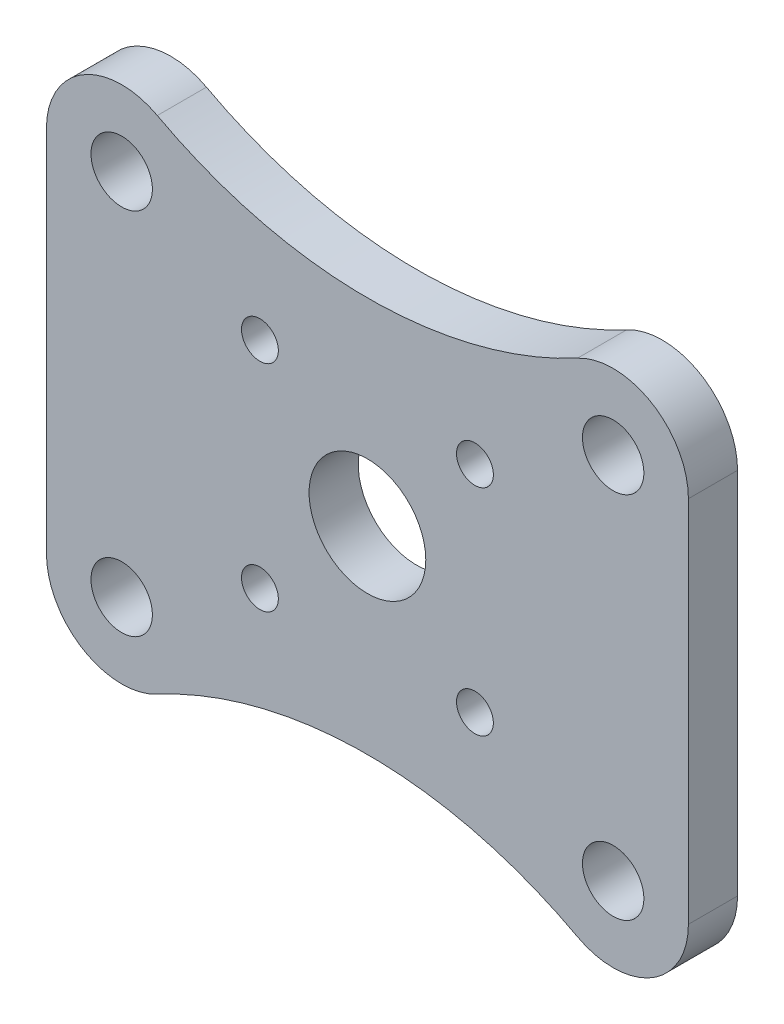
ISO-10303-21;
HEADER;
FILE_DESCRIPTION(('STEP AP214'),'2;1');
FILE_NAME('part.step','',(''),(''),'','','');
FILE_SCHEMA(('AUTOMOTIVE_DESIGN { 1 0 10303 214 1 1 1 1 }'));
ENDSEC;
DATA;
#1=APPLICATION_CONTEXT('core data for automotive mechanical design processes');
#2=APPLICATION_PROTOCOL_DEFINITION('international standard','automotive_design',2000,#1);
#3=PRODUCT_CONTEXT('',#1,'mechanical');
#4=PRODUCT('Part','Part','',(#3));
#5=PRODUCT_RELATED_PRODUCT_CATEGORY('part','',(#4));
#6=PRODUCT_DEFINITION_FORMATION('','',#4);
#7=PRODUCT_DEFINITION_CONTEXT('part definition',#1,'design');
#8=PRODUCT_DEFINITION('design','',#6,#7);
#9=PRODUCT_DEFINITION_SHAPE('','',#8);
#10=(LENGTH_UNIT() NAMED_UNIT(*) SI_UNIT(.MILLI.,.METRE.));
#11=(NAMED_UNIT(*) PLANE_ANGLE_UNIT() SI_UNIT($,.RADIAN.));
#12=(NAMED_UNIT(*) SI_UNIT($,.STERADIAN.) SOLID_ANGLE_UNIT());
#13=UNCERTAINTY_MEASURE_WITH_UNIT(LENGTH_MEASURE(1.E-05),#10,'distance_accuracy_value','');
#14=(GEOMETRIC_REPRESENTATION_CONTEXT(3) GLOBAL_UNCERTAINTY_ASSIGNED_CONTEXT((#13)) GLOBAL_UNIT_ASSIGNED_CONTEXT((#10,
#11,#12)) REPRESENTATION_CONTEXT('',''));
#15=CARTESIAN_POINT('',(0.,0.,0.));
#16=DIRECTION('',(0.,0.,1.));
#17=DIRECTION('',(1.,0.,0.));
#18=AXIS2_PLACEMENT_3D('',#15,#16,#17);
#19=CARTESIAN_POINT('',(0.,0.,4.));
#20=DIRECTION('',(0.,0.,1.));
#21=DIRECTION('',(1.,0.,0.));
#22=AXIS2_PLACEMENT_3D('',#19,#20,#21);
#23=PLANE('',#22);
#24=CARTESIAN_POINT('',(-19.9999999999997,-15.,4.));
#25=DIRECTION('',(0.,0.,1.));
#26=DIRECTION('',(1.,0.,0.));
#27=AXIS2_PLACEMENT_3D('',#24,#25,#26);
#28=CIRCLE('',#27,2.5);
#29=CARTESIAN_POINT('',(-17.4999999999997,-15.,4.));
#30=VERTEX_POINT('',#29);
#31=EDGE_CURVE('E251',#30,#30,#28,.T.);
#32=ORIENTED_EDGE('',*,*,#31,.F.);
#33=EDGE_LOOP('',(#32));
#34=FACE_BOUND('',#33,.T.);
#35=CARTESIAN_POINT('',(20.,15.,4.));
#36=DIRECTION('',(0.,0.,1.));
#37=DIRECTION('',(1.,0.,0.));
#38=AXIS2_PLACEMENT_3D('',#35,#36,#37);
#39=CIRCLE('',#38,2.5);
#40=CARTESIAN_POINT('',(22.5,15.,4.));
#41=VERTEX_POINT('',#40);
#42=EDGE_CURVE('E263',#41,#41,#39,.T.);
#43=ORIENTED_EDGE('',*,*,#42,.F.);
#44=EDGE_LOOP('',(#43));
#45=FACE_BOUND('',#44,.T.);
#46=CARTESIAN_POINT('',(8.75,-8.75,4.));
#47=DIRECTION('',(0.,0.,1.));
#48=DIRECTION('',(1.,0.,0.));
#49=AXIS2_PLACEMENT_3D('',#46,#47,#48);
#50=CIRCLE('',#49,1.5);
#51=CARTESIAN_POINT('',(10.25,-8.75,4.));
#52=VERTEX_POINT('',#51);
#53=EDGE_CURVE('E275',#52,#52,#50,.T.);
#54=ORIENTED_EDGE('',*,*,#53,.F.);
#55=EDGE_LOOP('',(#54));
#56=FACE_BOUND('',#55,.T.);
#57=CARTESIAN_POINT('',(-8.75,8.75,4.));
#58=DIRECTION('',(0.,0.,1.));
#59=DIRECTION('',(1.,0.,0.));
#60=AXIS2_PLACEMENT_3D('',#57,#58,#59);
#61=CIRCLE('',#60,1.5);
#62=CARTESIAN_POINT('',(-7.25,8.75,4.));
#63=VERTEX_POINT('',#62);
#64=EDGE_CURVE('E287',#63,#63,#61,.T.);
#65=ORIENTED_EDGE('',*,*,#64,.F.);
#66=EDGE_LOOP('',(#65));
#67=FACE_BOUND('',#66,.T.);
#68=CARTESIAN_POINT('',(-3.47638584585752E-12,-52.229186056365,4.));
#69=DIRECTION('',(0.,0.,1.));
#70=DIRECTION('',(1.,0.,0.));
#71=AXIS2_PLACEMENT_3D('',#68,#69,#70);
#72=CIRCLE('',#71,36.1376279352226);
#73=CARTESIAN_POINT('',(-17.1020202282195,-20.3944714055575,4.));
#74=VERTEX_POINT('',#73);
#75=CARTESIAN_POINT('',(17.1020202282176,-20.3944714055614,4.));
#76=VERTEX_POINT('',#75);
#77=EDGE_CURVE('E150',#74,#76,#72,.F.);
#78=ORIENTED_EDGE('',*,*,#77,.T.);
#79=CARTESIAN_POINT('',(20.0000000000003,-15.,4.));
#80=DIRECTION('',(0.,0.,1.));
#81=DIRECTION('',(1.,0.,0.));
#82=AXIS2_PLACEMENT_3D('',#79,#80,#81);
#83=CIRCLE('',#82,6.12361074065634);
#84=CARTESIAN_POINT('',(26.1236107406567,-15.,4.));
#85=VERTEX_POINT('',#84);
#86=EDGE_CURVE('E95',#76,#85,#83,.T.);
#87=ORIENTED_EDGE('',*,*,#86,.T.);
#88=DIRECTION('',(0.,-1.,0.));
#89=VECTOR('',#88,1.);
#90=CARTESIAN_POINT('',(26.1236107406565,2.7190344497458E-13,4.));
#91=LINE('',#90,#89);
#92=CARTESIAN_POINT('',(26.1236107406563,15.,4.));
#93=VERTEX_POINT('',#92);
#94=EDGE_CURVE('E162',#93,#85,#91,.T.);
#95=ORIENTED_EDGE('',*,*,#94,.F.);
#96=CARTESIAN_POINT('',(20.,15.,4.));
#97=DIRECTION('',(0.,0.,1.));
#98=DIRECTION('',(1.,0.,0.));
#99=AXIS2_PLACEMENT_3D('',#96,#97,#98);
#100=CIRCLE('',#99,6.12361074065634);
#101=CARTESIAN_POINT('',(17.1020202282174,20.3944714055615,4.));
#102=VERTEX_POINT('',#101);
#103=EDGE_CURVE('E175',#93,#102,#100,.T.);
#104=ORIENTED_EDGE('',*,*,#103,.T.);
#105=CARTESIAN_POINT('',(0.,52.2291860563482,4.));
#106=DIRECTION('',(0.,0.,1.));
#107=DIRECTION('',(1.,0.,0.));
#108=AXIS2_PLACEMENT_3D('',#105,#106,#107);
#109=CIRCLE('',#108,36.1376279352059);
#110=CARTESIAN_POINT('',(-17.1020202282174,20.3944714055615,4.));
#111=VERTEX_POINT('',#110);
#112=EDGE_CURVE('E115',#111,#102,#109,.T.);
#113=ORIENTED_EDGE('',*,*,#112,.F.);
#114=CARTESIAN_POINT('',(-20.,15.,4.));
#115=DIRECTION('',(0.,0.,1.));
#116=DIRECTION('',(1.,0.,0.));
#117=AXIS2_PLACEMENT_3D('',#114,#115,#116);
#118=CIRCLE('',#117,6.12361074065634);
#119=CARTESIAN_POINT('',(-26.1236107406563,15.,4.));
#120=VERTEX_POINT('',#119);
#121=EDGE_CURVE('E109',#111,#120,#118,.T.);
#122=ORIENTED_EDGE('',*,*,#121,.T.);
#123=DIRECTION('',(0.,-1.,0.));
#124=VECTOR('',#123,1.);
#125=CARTESIAN_POINT('',(-26.1236107406564,0.,4.));
#126=LINE('',#125,#124);
#127=CARTESIAN_POINT('',(-26.123610740656,-14.9999999999958,4.));
#128=VERTEX_POINT('',#127);
#129=EDGE_CURVE('E113',#120,#128,#126,.T.);
#130=ORIENTED_EDGE('',*,*,#129,.T.);
#131=CARTESIAN_POINT('',(-20.0000000000001,-14.9999999999958,4.));
#132=DIRECTION('',(0.,0.,1.));
#133=DIRECTION('',(1.,0.,0.));
#134=AXIS2_PLACEMENT_3D('',#131,#132,#133);
#135=CIRCLE('',#134,6.1236107406555);
#136=EDGE_CURVE('E52',#128,#74,#135,.T.);
#137=ORIENTED_EDGE('',*,*,#136,.T.);
#138=EDGE_LOOP('',(#78,#87,#95,#104,#113,#122,#130,#137));
#139=FACE_BOUND('',#138,.T.);
#140=CARTESIAN_POINT('',(-8.75,-8.75,4.));
#141=DIRECTION('',(0.,0.,1.));
#142=DIRECTION('',(1.,0.,0.));
#143=AXIS2_PLACEMENT_3D('',#140,#141,#142);
#144=CIRCLE('',#143,1.5);
#145=CARTESIAN_POINT('',(-7.25,-8.75,4.));
#146=VERTEX_POINT('',#145);
#147=EDGE_CURVE('E135',#146,#146,#144,.T.);
#148=ORIENTED_EDGE('',*,*,#147,.F.);
#149=EDGE_LOOP('',(#148));
#150=FACE_BOUND('',#149,.T.);
#151=CARTESIAN_POINT('',(8.75,8.75,4.));
#152=DIRECTION('',(0.,0.,1.));
#153=DIRECTION('',(1.,0.,0.));
#154=AXIS2_PLACEMENT_3D('',#151,#152,#153);
#155=CIRCLE('',#154,1.5);
#156=CARTESIAN_POINT('',(10.25,8.75,4.));
#157=VERTEX_POINT('',#156);
#158=EDGE_CURVE('E281',#157,#157,#155,.T.);
#159=ORIENTED_EDGE('',*,*,#158,.F.);
#160=EDGE_LOOP('',(#159));
#161=FACE_BOUND('',#160,.T.);
#162=CARTESIAN_POINT('',(0.,0.,4.));
#163=DIRECTION('',(0.,0.,1.));
#164=DIRECTION('',(1.,0.,0.));
#165=AXIS2_PLACEMENT_3D('',#162,#163,#164);
#166=CIRCLE('',#165,4.75);
#167=CARTESIAN_POINT('',(4.75,0.,4.));
#168=VERTEX_POINT('',#167);
#169=EDGE_CURVE('E269',#168,#168,#166,.T.);
#170=ORIENTED_EDGE('',*,*,#169,.F.);
#171=EDGE_LOOP('',(#170));
#172=FACE_BOUND('',#171,.T.);
#173=CARTESIAN_POINT('',(20.0000000000003,-15.,4.));
#174=DIRECTION('',(0.,0.,1.));
#175=DIRECTION('',(1.,0.,0.));
#176=AXIS2_PLACEMENT_3D('',#173,#174,#175);
#177=CIRCLE('',#176,2.5);
#178=CARTESIAN_POINT('',(22.5000000000003,-15.,4.));
#179=VERTEX_POINT('',#178);
#180=EDGE_CURVE('E257',#179,#179,#177,.T.);
#181=ORIENTED_EDGE('',*,*,#180,.F.);
#182=EDGE_LOOP('',(#181));
#183=FACE_BOUND('',#182,.T.);
#184=CARTESIAN_POINT('',(-20.,15.,4.));
#185=DIRECTION('',(0.,0.,1.));
#186=DIRECTION('',(1.,0.,0.));
#187=AXIS2_PLACEMENT_3D('',#184,#185,#186);
#188=CIRCLE('',#187,2.5);
#189=CARTESIAN_POINT('',(-17.5,15.,4.));
#190=VERTEX_POINT('',#189);
#191=EDGE_CURVE('E242',#190,#190,#188,.T.);
#192=ORIENTED_EDGE('',*,*,#191,.F.);
#193=EDGE_LOOP('',(#192));
#194=FACE_BOUND('',#193,.T.);
#195=ADVANCED_FACE('F35',(#34,#45,#56,#67,#139,#150,#161,#172,#183,#194),#23,.T.);
#196=CARTESIAN_POINT('',(0.,0.,0.));
#197=DIRECTION('',(0.,0.,1.));
#198=DIRECTION('',(1.,0.,0.));
#199=AXIS2_PLACEMENT_3D('',#196,#197,#198);
#200=PLANE('',#199);
#201=CARTESIAN_POINT('',(-19.9999999999997,-15.,0.));
#202=DIRECTION('',(0.,0.,1.));
#203=DIRECTION('',(1.,0.,0.));
#204=AXIS2_PLACEMENT_3D('',#201,#202,#203);
#205=CIRCLE('',#204,2.5);
#206=CARTESIAN_POINT('',(-17.4999999999997,-15.,0.));
#207=VERTEX_POINT('',#206);
#208=EDGE_CURVE('E248',#207,#207,#205,.T.);
#209=ORIENTED_EDGE('',*,*,#208,.T.);
#210=EDGE_LOOP('',(#209));
#211=FACE_BOUND('',#210,.T.);
#212=CARTESIAN_POINT('',(20.,15.,0.));
#213=DIRECTION('',(0.,0.,1.));
#214=DIRECTION('',(1.,0.,0.));
#215=AXIS2_PLACEMENT_3D('',#212,#213,#214);
#216=CIRCLE('',#215,2.5);
#217=CARTESIAN_POINT('',(22.5,15.,0.));
#218=VERTEX_POINT('',#217);
#219=EDGE_CURVE('E260',#218,#218,#216,.T.);
#220=ORIENTED_EDGE('',*,*,#219,.T.);
#221=EDGE_LOOP('',(#220));
#222=FACE_BOUND('',#221,.T.);
#223=CARTESIAN_POINT('',(8.75,-8.75,0.));
#224=DIRECTION('',(0.,0.,1.));
#225=DIRECTION('',(1.,0.,0.));
#226=AXIS2_PLACEMENT_3D('',#223,#224,#225);
#227=CIRCLE('',#226,1.5);
#228=CARTESIAN_POINT('',(10.25,-8.75,0.));
#229=VERTEX_POINT('',#228);
#230=EDGE_CURVE('E272',#229,#229,#227,.T.);
#231=ORIENTED_EDGE('',*,*,#230,.T.);
#232=EDGE_LOOP('',(#231));
#233=FACE_BOUND('',#232,.T.);
#234=CARTESIAN_POINT('',(-8.75,8.75,0.));
#235=DIRECTION('',(0.,0.,1.));
#236=DIRECTION('',(1.,0.,0.));
#237=AXIS2_PLACEMENT_3D('',#234,#235,#236);
#238=CIRCLE('',#237,1.5);
#239=CARTESIAN_POINT('',(-7.25,8.75,0.));
#240=VERTEX_POINT('',#239);
#241=EDGE_CURVE('E284',#240,#240,#238,.T.);
#242=ORIENTED_EDGE('',*,*,#241,.T.);
#243=EDGE_LOOP('',(#242));
#244=FACE_BOUND('',#243,.T.);
#245=CARTESIAN_POINT('',(-3.47638584585752E-12,-52.229186056365,0.));
#246=DIRECTION('',(0.,0.,1.));
#247=DIRECTION('',(1.,0.,0.));
#248=AXIS2_PLACEMENT_3D('',#245,#246,#247);
#249=CIRCLE('',#248,36.1376279352226);
#250=CARTESIAN_POINT('',(-17.1020202282195,-20.3944714055575,0.));
#251=VERTEX_POINT('',#250);
#252=CARTESIAN_POINT('',(17.1020202282176,-20.3944714055614,0.));
#253=VERTEX_POINT('',#252);
#254=EDGE_CURVE('E131',#251,#253,#249,.F.);
#255=ORIENTED_EDGE('',*,*,#254,.F.);
#256=CARTESIAN_POINT('',(-20.0000000000001,-14.9999999999958,0.));
#257=DIRECTION('',(0.,0.,1.));
#258=DIRECTION('',(1.,0.,0.));
#259=AXIS2_PLACEMENT_3D('',#256,#257,#258);
#260=CIRCLE('',#259,6.1236107406555);
#261=CARTESIAN_POINT('',(-26.123610740656,-14.9999999999958,0.));
#262=VERTEX_POINT('',#261);
#263=EDGE_CURVE('E87',#262,#251,#260,.T.);
#264=ORIENTED_EDGE('',*,*,#263,.F.);
#265=DIRECTION('',(0.,-1.,0.));
#266=VECTOR('',#265,1.);
#267=CARTESIAN_POINT('',(-26.1236107406564,0.,0.));
#268=LINE('',#267,#266);
#269=CARTESIAN_POINT('',(-26.1236107406563,15.,0.));
#270=VERTEX_POINT('',#269);
#271=EDGE_CURVE('E81',#270,#262,#268,.T.);
#272=ORIENTED_EDGE('',*,*,#271,.F.);
#273=CARTESIAN_POINT('',(-20.,15.,0.));
#274=DIRECTION('',(0.,0.,1.));
#275=DIRECTION('',(1.,0.,0.));
#276=AXIS2_PLACEMENT_3D('',#273,#274,#275);
#277=CIRCLE('',#276,6.12361074065634);
#278=CARTESIAN_POINT('',(-17.1020202282174,20.3944714055615,0.));
#279=VERTEX_POINT('',#278);
#280=EDGE_CURVE('E121',#279,#270,#277,.T.);
#281=ORIENTED_EDGE('',*,*,#280,.F.);
#282=CARTESIAN_POINT('',(0.,52.2291860563482,0.));
#283=DIRECTION('',(0.,0.,1.));
#284=DIRECTION('',(1.,0.,0.));
#285=AXIS2_PLACEMENT_3D('',#282,#283,#284);
#286=CIRCLE('',#285,36.1376279352059);
#287=CARTESIAN_POINT('',(17.1020202282174,20.3944714055615,0.));
#288=VERTEX_POINT('',#287);
#289=EDGE_CURVE('E144',#279,#288,#286,.T.);
#290=ORIENTED_EDGE('',*,*,#289,.T.);
#291=CARTESIAN_POINT('',(20.,15.,0.));
#292=DIRECTION('',(0.,0.,1.));
#293=DIRECTION('',(1.,0.,0.));
#294=AXIS2_PLACEMENT_3D('',#291,#292,#293);
#295=CIRCLE('',#294,6.12361074065634);
#296=CARTESIAN_POINT('',(26.1236107406563,15.,0.));
#297=VERTEX_POINT('',#296);
#298=EDGE_CURVE('E141',#297,#288,#295,.T.);
#299=ORIENTED_EDGE('',*,*,#298,.F.);
#300=DIRECTION('',(0.,-1.,0.));
#301=VECTOR('',#300,1.);
#302=CARTESIAN_POINT('',(26.1236107406565,2.7190344497458E-13,0.));
#303=LINE('',#302,#301);
#304=CARTESIAN_POINT('',(26.1236107406567,-15.,0.));
#305=VERTEX_POINT('',#304);
#306=EDGE_CURVE('E138',#297,#305,#303,.T.);
#307=ORIENTED_EDGE('',*,*,#306,.T.);
#308=CARTESIAN_POINT('',(20.0000000000003,-15.,0.));
#309=DIRECTION('',(0.,0.,1.));
#310=DIRECTION('',(1.,0.,0.));
#311=AXIS2_PLACEMENT_3D('',#308,#309,#310);
#312=CIRCLE('',#311,6.12361074065634);
#313=EDGE_CURVE('E134',#253,#305,#312,.T.);
#314=ORIENTED_EDGE('',*,*,#313,.F.);
#315=EDGE_LOOP('',(#255,#264,#272,#281,#290,#299,#307,#314));
#316=FACE_BOUND('',#315,.T.);
#317=CARTESIAN_POINT('',(-8.75,-8.75,0.));
#318=DIRECTION('',(0.,0.,1.));
#319=DIRECTION('',(1.,0.,0.));
#320=AXIS2_PLACEMENT_3D('',#317,#318,#319);
#321=CIRCLE('',#320,1.5);
#322=CARTESIAN_POINT('',(-7.25,-8.75,0.));
#323=VERTEX_POINT('',#322);
#324=EDGE_CURVE('E290',#323,#323,#321,.T.);
#325=ORIENTED_EDGE('',*,*,#324,.T.);
#326=EDGE_LOOP('',(#325));
#327=FACE_BOUND('',#326,.T.);
#328=CARTESIAN_POINT('',(8.75,8.75,0.));
#329=DIRECTION('',(0.,0.,1.));
#330=DIRECTION('',(1.,0.,0.));
#331=AXIS2_PLACEMENT_3D('',#328,#329,#330);
#332=CIRCLE('',#331,1.5);
#333=CARTESIAN_POINT('',(10.25,8.75,0.));
#334=VERTEX_POINT('',#333);
#335=EDGE_CURVE('E278',#334,#334,#332,.T.);
#336=ORIENTED_EDGE('',*,*,#335,.T.);
#337=EDGE_LOOP('',(#336));
#338=FACE_BOUND('',#337,.T.);
#339=CARTESIAN_POINT('',(0.,0.,0.));
#340=DIRECTION('',(0.,0.,1.));
#341=DIRECTION('',(1.,0.,0.));
#342=AXIS2_PLACEMENT_3D('',#339,#340,#341);
#343=CIRCLE('',#342,4.75);
#344=CARTESIAN_POINT('',(4.75,0.,0.));
#345=VERTEX_POINT('',#344);
#346=EDGE_CURVE('E266',#345,#345,#343,.T.);
#347=ORIENTED_EDGE('',*,*,#346,.T.);
#348=EDGE_LOOP('',(#347));
#349=FACE_BOUND('',#348,.T.);
#350=CARTESIAN_POINT('',(20.0000000000003,-15.,0.));
#351=DIRECTION('',(0.,0.,1.));
#352=DIRECTION('',(1.,0.,0.));
#353=AXIS2_PLACEMENT_3D('',#350,#351,#352);
#354=CIRCLE('',#353,2.5);
#355=CARTESIAN_POINT('',(22.5000000000003,-15.,0.));
#356=VERTEX_POINT('',#355);
#357=EDGE_CURVE('E254',#356,#356,#354,.T.);
#358=ORIENTED_EDGE('',*,*,#357,.T.);
#359=EDGE_LOOP('',(#358));
#360=FACE_BOUND('',#359,.T.);
#361=CARTESIAN_POINT('',(-20.,15.,0.));
#362=DIRECTION('',(0.,0.,1.));
#363=DIRECTION('',(1.,0.,0.));
#364=AXIS2_PLACEMENT_3D('',#361,#362,#363);
#365=CIRCLE('',#364,2.5);
#366=CARTESIAN_POINT('',(-17.5,15.,0.));
#367=VERTEX_POINT('',#366);
#368=EDGE_CURVE('E245',#367,#367,#365,.T.);
#369=ORIENTED_EDGE('',*,*,#368,.T.);
#370=EDGE_LOOP('',(#369));
#371=FACE_BOUND('',#370,.T.);
#372=ADVANCED_FACE('F168',(#211,#222,#233,#244,#316,#327,#338,#349,#360,#371),#200,.F.);
#373=CARTESIAN_POINT('',(-3.47638584585752E-12,-52.229186056365,4.));
#374=DIRECTION('',(0.,0.,-1.));
#375=DIRECTION('',(-1.,0.,0.));
#376=AXIS2_PLACEMENT_3D('',#373,#374,#375);
#377=CYLINDRICAL_SURFACE('',#376,36.1376279352226);
#378=ORIENTED_EDGE('',*,*,#254,.T.);
#379=DIRECTION('',(0.,0.,-1.));
#380=VECTOR('',#379,1.);
#381=CARTESIAN_POINT('',(17.1020202282176,-20.3944714055614,4.));
#382=LINE('',#381,#380);
#383=EDGE_CURVE('E11',#76,#253,#382,.T.);
#384=ORIENTED_EDGE('',*,*,#383,.F.);
#385=ORIENTED_EDGE('',*,*,#77,.F.);
#386=DIRECTION('',(0.,0.,-1.));
#387=VECTOR('',#386,1.);
#388=CARTESIAN_POINT('',(-17.1020202282195,-20.3944714055575,4.));
#389=LINE('',#388,#387);
#390=EDGE_CURVE('E127',#74,#251,#389,.T.);
#391=ORIENTED_EDGE('',*,*,#390,.T.);
#392=EDGE_LOOP('',(#378,#384,#385,#391));
#393=FACE_BOUND('',#392,.T.);
#394=ADVANCED_FACE('F37',(#393),#377,.F.);
#395=CARTESIAN_POINT('',(20.0000000000003,-15.,4.));
#396=DIRECTION('',(0.,0.,-1.));
#397=DIRECTION('',(-1.,0.,0.));
#398=AXIS2_PLACEMENT_3D('',#395,#396,#397);
#399=CYLINDRICAL_SURFACE('',#398,6.12361074065634);
#400=ORIENTED_EDGE('',*,*,#313,.T.);
#401=DIRECTION('',(0.,0.,-1.));
#402=VECTOR('',#401,1.);
#403=CARTESIAN_POINT('',(26.1236107406567,-15.,4.));
#404=LINE('',#403,#402);
#405=EDGE_CURVE('E44',#85,#305,#404,.T.);
#406=ORIENTED_EDGE('',*,*,#405,.F.);
#407=ORIENTED_EDGE('',*,*,#86,.F.);
#408=ORIENTED_EDGE('',*,*,#383,.T.);
#409=EDGE_LOOP('',(#400,#406,#407,#408));
#410=FACE_BOUND('',#409,.T.);
#411=ADVANCED_FACE('F163',(#410),#399,.T.);
#412=CARTESIAN_POINT('',(26.1236107406565,2.7190344497458E-13,4.));
#413=DIRECTION('',(1.,0.,0.));
#414=DIRECTION('',(0.,1.,0.));
#415=AXIS2_PLACEMENT_3D('',#412,#413,#414);
#416=PLANE('',#415);
#417=ORIENTED_EDGE('',*,*,#306,.F.);
#418=DIRECTION('',(0.,0.,-1.));
#419=VECTOR('',#418,1.);
#420=CARTESIAN_POINT('',(26.1236107406563,15.,4.));
#421=LINE('',#420,#419);
#422=EDGE_CURVE('E156',#93,#297,#421,.T.);
#423=ORIENTED_EDGE('',*,*,#422,.F.);
#424=ORIENTED_EDGE('',*,*,#94,.T.);
#425=ORIENTED_EDGE('',*,*,#405,.T.);
#426=EDGE_LOOP('',(#417,#423,#424,#425));
#427=FACE_BOUND('',#426,.T.);
#428=ADVANCED_FACE('F160',(#427),#416,.T.);
#429=CARTESIAN_POINT('',(20.,15.,4.));
#430=DIRECTION('',(0.,0.,-1.));
#431=DIRECTION('',(-1.,0.,0.));
#432=AXIS2_PLACEMENT_3D('',#429,#430,#431);
#433=CYLINDRICAL_SURFACE('',#432,6.12361074065634);
#434=ORIENTED_EDGE('',*,*,#298,.T.);
#435=DIRECTION('',(0.,0.,-1.));
#436=VECTOR('',#435,1.);
#437=CARTESIAN_POINT('',(17.1020202282174,20.3944714055615,4.));
#438=LINE('',#437,#436);
#439=EDGE_CURVE('E154',#102,#288,#438,.T.);
#440=ORIENTED_EDGE('',*,*,#439,.F.);
#441=ORIENTED_EDGE('',*,*,#103,.F.);
#442=ORIENTED_EDGE('',*,*,#422,.T.);
#443=EDGE_LOOP('',(#434,#440,#441,#442));
#444=FACE_BOUND('',#443,.T.);
#445=ADVANCED_FACE('F173',(#444),#433,.T.);
#446=CARTESIAN_POINT('',(0.,52.2291860563482,4.));
#447=DIRECTION('',(0.,0.,-1.));
#448=DIRECTION('',(-1.,0.,0.));
#449=AXIS2_PLACEMENT_3D('',#446,#447,#448);
#450=CYLINDRICAL_SURFACE('',#449,36.1376279352059);
#451=ORIENTED_EDGE('',*,*,#289,.F.);
#452=DIRECTION('',(0.,0.,-1.));
#453=VECTOR('',#452,1.);
#454=CARTESIAN_POINT('',(-17.1020202282174,20.3944714055615,4.));
#455=LINE('',#454,#453);
#456=EDGE_CURVE('E122',#111,#279,#455,.T.);
#457=ORIENTED_EDGE('',*,*,#456,.F.);
#458=ORIENTED_EDGE('',*,*,#112,.T.);
#459=ORIENTED_EDGE('',*,*,#439,.T.);
#460=EDGE_LOOP('',(#451,#457,#458,#459));
#461=FACE_BOUND('',#460,.T.);
#462=ADVANCED_FACE('F181',(#461),#450,.F.);
#463=CARTESIAN_POINT('',(-20.,15.,4.));
#464=DIRECTION('',(0.,0.,-1.));
#465=DIRECTION('',(-1.,0.,0.));
#466=AXIS2_PLACEMENT_3D('',#463,#464,#465);
#467=CYLINDRICAL_SURFACE('',#466,6.12361074065634);
#468=ORIENTED_EDGE('',*,*,#280,.T.);
#469=DIRECTION('',(0.,0.,-1.));
#470=VECTOR('',#469,1.);
#471=CARTESIAN_POINT('',(-26.1236107406563,15.,4.));
#472=LINE('',#471,#470);
#473=EDGE_CURVE('E118',#120,#270,#472,.T.);
#474=ORIENTED_EDGE('',*,*,#473,.F.);
#475=ORIENTED_EDGE('',*,*,#121,.F.);
#476=ORIENTED_EDGE('',*,*,#456,.T.);
#477=EDGE_LOOP('',(#468,#474,#475,#476));
#478=FACE_BOUND('',#477,.T.);
#479=ADVANCED_FACE('F119',(#478),#467,.T.);
#480=CARTESIAN_POINT('',(-26.1236107406564,0.,4.));
#481=DIRECTION('',(1.,0.,0.));
#482=DIRECTION('',(0.,1.,0.));
#483=AXIS2_PLACEMENT_3D('',#480,#481,#482);
#484=PLANE('',#483);
#485=ORIENTED_EDGE('',*,*,#271,.T.);
#486=DIRECTION('',(0.,0.,-1.));
#487=VECTOR('',#486,1.);
#488=CARTESIAN_POINT('',(-26.123610740656,-14.9999999999958,4.));
#489=LINE('',#488,#487);
#490=EDGE_CURVE('E123',#128,#262,#489,.T.);
#491=ORIENTED_EDGE('',*,*,#490,.F.);
#492=ORIENTED_EDGE('',*,*,#129,.F.);
#493=ORIENTED_EDGE('',*,*,#473,.T.);
#494=EDGE_LOOP('',(#485,#491,#492,#493));
#495=FACE_BOUND('',#494,.T.);
#496=ADVANCED_FACE('F125',(#495),#484,.F.);
#497=CARTESIAN_POINT('',(-20.0000000000001,-14.9999999999958,4.));
#498=DIRECTION('',(0.,0.,-1.));
#499=DIRECTION('',(-1.,0.,0.));
#500=AXIS2_PLACEMENT_3D('',#497,#498,#499);
#501=CYLINDRICAL_SURFACE('',#500,6.1236107406555);
#502=ORIENTED_EDGE('',*,*,#263,.T.);
#503=ORIENTED_EDGE('',*,*,#390,.F.);
#504=ORIENTED_EDGE('',*,*,#136,.F.);
#505=ORIENTED_EDGE('',*,*,#490,.T.);
#506=EDGE_LOOP('',(#502,#503,#504,#505));
#507=FACE_BOUND('',#506,.T.);
#508=ADVANCED_FACE('F184',(#507),#501,.T.);
#509=CARTESIAN_POINT('',(-8.75,-8.75,4.));
#510=DIRECTION('',(0.,0.,-1.));
#511=DIRECTION('',(-1.,0.,0.));
#512=AXIS2_PLACEMENT_3D('',#509,#510,#511);
#513=CYLINDRICAL_SURFACE('',#512,1.5);
#514=ORIENTED_EDGE('',*,*,#147,.T.);
#515=EDGE_LOOP('',(#514));
#516=FACE_BOUND('',#515,.T.);
#517=ORIENTED_EDGE('',*,*,#324,.F.);
#518=EDGE_LOOP('',(#517));
#519=FACE_BOUND('',#518,.T.);
#520=ADVANCED_FACE('F186',(#516,#519),#513,.F.);
#521=CARTESIAN_POINT('',(-8.75,8.75,4.));
#522=DIRECTION('',(0.,0.,-1.));
#523=DIRECTION('',(-1.,0.,0.));
#524=AXIS2_PLACEMENT_3D('',#521,#522,#523);
#525=CYLINDRICAL_SURFACE('',#524,1.5);
#526=ORIENTED_EDGE('',*,*,#64,.T.);
#527=EDGE_LOOP('',(#526));
#528=FACE_BOUND('',#527,.T.);
#529=ORIENTED_EDGE('',*,*,#241,.F.);
#530=EDGE_LOOP('',(#529));
#531=FACE_BOUND('',#530,.T.);
#532=ADVANCED_FACE('F192',(#528,#531),#525,.F.);
#533=CARTESIAN_POINT('',(8.75,8.75,4.));
#534=DIRECTION('',(0.,0.,-1.));
#535=DIRECTION('',(-1.,0.,0.));
#536=AXIS2_PLACEMENT_3D('',#533,#534,#535);
#537=CYLINDRICAL_SURFACE('',#536,1.5);
#538=ORIENTED_EDGE('',*,*,#158,.T.);
#539=EDGE_LOOP('',(#538));
#540=FACE_BOUND('',#539,.T.);
#541=ORIENTED_EDGE('',*,*,#335,.F.);
#542=EDGE_LOOP('',(#541));
#543=FACE_BOUND('',#542,.T.);
#544=ADVANCED_FACE('F209',(#540,#543),#537,.F.);
#545=CARTESIAN_POINT('',(8.75,-8.75,4.));
#546=DIRECTION('',(0.,0.,-1.));
#547=DIRECTION('',(-1.,0.,0.));
#548=AXIS2_PLACEMENT_3D('',#545,#546,#547);
#549=CYLINDRICAL_SURFACE('',#548,1.5);
#550=ORIENTED_EDGE('',*,*,#53,.T.);
#551=EDGE_LOOP('',(#550));
#552=FACE_BOUND('',#551,.T.);
#553=ORIENTED_EDGE('',*,*,#230,.F.);
#554=EDGE_LOOP('',(#553));
#555=FACE_BOUND('',#554,.T.);
#556=ADVANCED_FACE('F213',(#552,#555),#549,.F.);
#557=CARTESIAN_POINT('',(0.,0.,4.));
#558=DIRECTION('',(0.,0.,-1.));
#559=DIRECTION('',(-1.,0.,0.));
#560=AXIS2_PLACEMENT_3D('',#557,#558,#559);
#561=CYLINDRICAL_SURFACE('',#560,4.75);
#562=ORIENTED_EDGE('',*,*,#169,.T.);
#563=EDGE_LOOP('',(#562));
#564=FACE_BOUND('',#563,.T.);
#565=ORIENTED_EDGE('',*,*,#346,.F.);
#566=EDGE_LOOP('',(#565));
#567=FACE_BOUND('',#566,.T.);
#568=ADVANCED_FACE('F217',(#564,#567),#561,.F.);
#569=CARTESIAN_POINT('',(20.,15.,4.));
#570=DIRECTION('',(0.,0.,-1.));
#571=DIRECTION('',(-1.,0.,0.));
#572=AXIS2_PLACEMENT_3D('',#569,#570,#571);
#573=CYLINDRICAL_SURFACE('',#572,2.5);
#574=ORIENTED_EDGE('',*,*,#42,.T.);
#575=EDGE_LOOP('',(#574));
#576=FACE_BOUND('',#575,.T.);
#577=ORIENTED_EDGE('',*,*,#219,.F.);
#578=EDGE_LOOP('',(#577));
#579=FACE_BOUND('',#578,.T.);
#580=ADVANCED_FACE('F221',(#576,#579),#573,.F.);
#581=CARTESIAN_POINT('',(20.0000000000003,-15.,4.));
#582=DIRECTION('',(0.,0.,-1.));
#583=DIRECTION('',(-1.,0.,0.));
#584=AXIS2_PLACEMENT_3D('',#581,#582,#583);
#585=CYLINDRICAL_SURFACE('',#584,2.5);
#586=ORIENTED_EDGE('',*,*,#180,.T.);
#587=EDGE_LOOP('',(#586));
#588=FACE_BOUND('',#587,.T.);
#589=ORIENTED_EDGE('',*,*,#357,.F.);
#590=EDGE_LOOP('',(#589));
#591=FACE_BOUND('',#590,.T.);
#592=ADVANCED_FACE('F225',(#588,#591),#585,.F.);
#593=CARTESIAN_POINT('',(-19.9999999999997,-15.,4.));
#594=DIRECTION('',(0.,0.,-1.));
#595=DIRECTION('',(-1.,0.,0.));
#596=AXIS2_PLACEMENT_3D('',#593,#594,#595);
#597=CYLINDRICAL_SURFACE('',#596,2.5);
#598=ORIENTED_EDGE('',*,*,#31,.T.);
#599=EDGE_LOOP('',(#598));
#600=FACE_BOUND('',#599,.T.);
#601=ORIENTED_EDGE('',*,*,#208,.F.);
#602=EDGE_LOOP('',(#601));
#603=FACE_BOUND('',#602,.T.);
#604=ADVANCED_FACE('F229',(#600,#603),#597,.F.);
#605=CARTESIAN_POINT('',(-20.,15.,4.));
#606=DIRECTION('',(0.,0.,-1.));
#607=DIRECTION('',(-1.,0.,0.));
#608=AXIS2_PLACEMENT_3D('',#605,#606,#607);
#609=CYLINDRICAL_SURFACE('',#608,2.5);
#610=ORIENTED_EDGE('',*,*,#191,.T.);
#611=EDGE_LOOP('',(#610));
#612=FACE_BOUND('',#611,.T.);
#613=ORIENTED_EDGE('',*,*,#368,.F.);
#614=EDGE_LOOP('',(#613));
#615=FACE_BOUND('',#614,.T.);
#616=ADVANCED_FACE('F233',(#612,#615),#609,.F.);
#617=CLOSED_SHELL('',(#195,#372,#394,#411,#428,#445,#462,#479,#496,#508,#520,#532,#544,#556,
#568,#580,#592,#604,#616));
#618=MANIFOLD_SOLID_BREP('B2',#617);
#619=ADVANCED_BREP_SHAPE_REPRESENTATION('',(#18,#618),#14);
#620=SHAPE_DEFINITION_REPRESENTATION(#9,#619);
ENDSEC;
END-ISO-10303-21;
